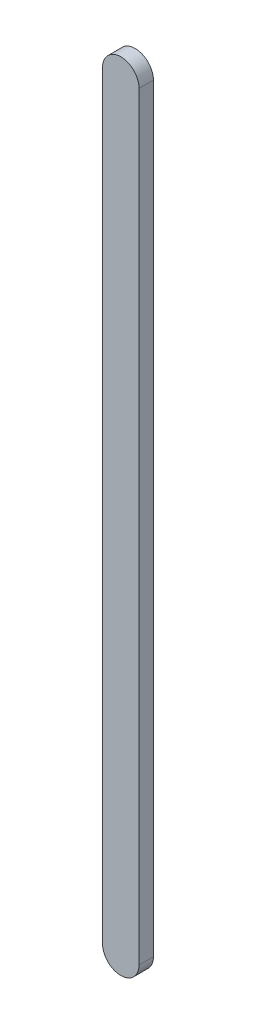
ISO-10303-21;
HEADER;
FILE_DESCRIPTION(('STEP AP214'),'2;1');
FILE_NAME('part.step','',(''),(''),'','','');
FILE_SCHEMA(('AUTOMOTIVE_DESIGN { 1 0 10303 214 1 1 1 1 }'));
ENDSEC;
DATA;
#1=APPLICATION_CONTEXT('core data for automotive mechanical design processes');
#2=APPLICATION_PROTOCOL_DEFINITION('international standard','automotive_design',2000,#1);
#3=PRODUCT_CONTEXT('',#1,'mechanical');
#4=PRODUCT('Part','Part','',(#3));
#5=PRODUCT_RELATED_PRODUCT_CATEGORY('part','',(#4));
#6=PRODUCT_DEFINITION_FORMATION('','',#4);
#7=PRODUCT_DEFINITION_CONTEXT('part definition',#1,'design');
#8=PRODUCT_DEFINITION('design','',#6,#7);
#9=PRODUCT_DEFINITION_SHAPE('','',#8);
#10=(LENGTH_UNIT() NAMED_UNIT(*) SI_UNIT(.MILLI.,.METRE.));
#11=(NAMED_UNIT(*) PLANE_ANGLE_UNIT() SI_UNIT($,.RADIAN.));
#12=(NAMED_UNIT(*) SI_UNIT($,.STERADIAN.) SOLID_ANGLE_UNIT());
#13=UNCERTAINTY_MEASURE_WITH_UNIT(LENGTH_MEASURE(1.E-05),#10,'distance_accuracy_value','');
#14=(GEOMETRIC_REPRESENTATION_CONTEXT(3) GLOBAL_UNCERTAINTY_ASSIGNED_CONTEXT((#13)) GLOBAL_UNIT_ASSIGNED_CONTEXT((#10,
#11,#12)) REPRESENTATION_CONTEXT('',''));
#15=CARTESIAN_POINT('',(0.,0.,0.));
#16=DIRECTION('',(0.,0.,1.));
#17=DIRECTION('',(1.,0.,0.));
#18=AXIS2_PLACEMENT_3D('',#15,#16,#17);
#19=CARTESIAN_POINT('',(142.24,85.8805496,0.));
#20=DIRECTION('',(-1.,0.,0.));
#21=DIRECTION('',(0.,1.,0.));
#22=AXIS2_PLACEMENT_3D('',#19,#20,#21);
#23=PLANE('',#22);
#24=DIRECTION('',(0.,1.,0.));
#25=VECTOR('',#24,1.);
#26=CARTESIAN_POINT('',(142.24,85.8805496,0.1999996));
#27=LINE('',#26,#25);
#28=CARTESIAN_POINT('',(142.24,85.8805496,0.1999996));
#29=VERTEX_POINT('',#28);
#30=CARTESIAN_POINT('',(142.24,96.4452732,0.1999996));
#31=VERTEX_POINT('',#30);
#32=EDGE_CURVE('E11',#29,#31,#27,.T.);
#33=ORIENTED_EDGE('',*,*,#32,.F.);
#34=DIRECTION('',(0.,0.,1.));
#35=VECTOR('',#34,1.);
#36=CARTESIAN_POINT('',(142.24,85.8805496,0.));
#37=LINE('',#36,#35);
#38=CARTESIAN_POINT('',(142.24,85.8805496,0.));
#39=VERTEX_POINT('',#38);
#40=EDGE_CURVE('E24',#39,#29,#37,.T.);
#41=ORIENTED_EDGE('',*,*,#40,.F.);
#42=DIRECTION('',(0.,1.,0.));
#43=VECTOR('',#42,1.);
#44=CARTESIAN_POINT('',(142.24,85.8805496,0.));
#45=LINE('',#44,#43);
#46=CARTESIAN_POINT('',(142.24,96.4452732,0.));
#47=VERTEX_POINT('',#46);
#48=EDGE_CURVE('E75',#39,#47,#45,.T.);
#49=ORIENTED_EDGE('',*,*,#48,.T.);
#50=DIRECTION('',(0.,0.,1.));
#51=VECTOR('',#50,1.);
#52=CARTESIAN_POINT('',(142.24,96.4452732,0.));
#53=LINE('',#52,#51);
#54=EDGE_CURVE('E37',#47,#31,#53,.T.);
#55=ORIENTED_EDGE('',*,*,#54,.T.);
#56=EDGE_LOOP('',(#33,#41,#49,#55));
#57=FACE_BOUND('',#56,.T.);
#58=ADVANCED_FACE('F17',(#57),#23,.F.);
#59=CARTESIAN_POINT('',(141.986,96.4452732,0.));
#60=DIRECTION('',(0.,0.,-1.));
#61=DIRECTION('',(1.,1.1189649382048E-13,0.));
#62=AXIS2_PLACEMENT_3D('',#59,#60,#61);
#63=CYLINDRICAL_SURFACE('',#62,0.25400000000001);
#64=CARTESIAN_POINT('',(141.986,96.4452732,0.1999996));
#65=DIRECTION('',(0.,0.,1.));
#66=DIRECTION('',(1.,1.1189649382048E-13,0.));
#67=AXIS2_PLACEMENT_3D('',#64,#65,#66);
#68=CIRCLE('',#67,0.25400000000001);
#69=CARTESIAN_POINT('',(141.732,96.4452732,0.1999996));
#70=VERTEX_POINT('',#69);
#71=EDGE_CURVE('E83',#31,#70,#68,.T.);
#72=ORIENTED_EDGE('',*,*,#71,.F.);
#73=ORIENTED_EDGE('',*,*,#54,.F.);
#74=CARTESIAN_POINT('',(141.986,96.4452732,0.));
#75=DIRECTION('',(0.,0.,1.));
#76=DIRECTION('',(1.,1.1189649382048E-13,0.));
#77=AXIS2_PLACEMENT_3D('',#74,#75,#76);
#78=CIRCLE('',#77,0.25400000000001);
#79=CARTESIAN_POINT('',(141.732,96.4452732,0.));
#80=VERTEX_POINT('',#79);
#81=EDGE_CURVE('E81',#47,#80,#78,.T.);
#82=ORIENTED_EDGE('',*,*,#81,.T.);
#83=DIRECTION('',(0.,0.,1.));
#84=VECTOR('',#83,1.);
#85=CARTESIAN_POINT('',(141.732,96.4452732,0.));
#86=LINE('',#85,#84);
#87=EDGE_CURVE('E67',#80,#70,#86,.T.);
#88=ORIENTED_EDGE('',*,*,#87,.T.);
#89=EDGE_LOOP('',(#72,#73,#82,#88));
#90=FACE_BOUND('',#89,.T.);
#91=ADVANCED_FACE('F89',(#90),#63,.T.);
#92=CARTESIAN_POINT('',(141.732,96.4452732,0.));
#93=DIRECTION('',(1.,0.,0.));
#94=DIRECTION('',(0.,-1.,0.));
#95=AXIS2_PLACEMENT_3D('',#92,#93,#94);
#96=PLANE('',#95);
#97=DIRECTION('',(0.,-1.,0.));
#98=VECTOR('',#97,1.);
#99=CARTESIAN_POINT('',(141.732,96.4452732,0.1999996));
#100=LINE('',#99,#98);
#101=CARTESIAN_POINT('',(141.732,85.8805496,0.1999996));
#102=VERTEX_POINT('',#101);
#103=EDGE_CURVE('E71',#70,#102,#100,.T.);
#104=ORIENTED_EDGE('',*,*,#103,.F.);
#105=ORIENTED_EDGE('',*,*,#87,.F.);
#106=DIRECTION('',(0.,-1.,0.));
#107=VECTOR('',#106,1.);
#108=CARTESIAN_POINT('',(141.732,96.4452732,0.));
#109=LINE('',#108,#107);
#110=CARTESIAN_POINT('',(141.732,85.8805496,0.));
#111=VERTEX_POINT('',#110);
#112=EDGE_CURVE('E63',#80,#111,#109,.T.);
#113=ORIENTED_EDGE('',*,*,#112,.T.);
#114=DIRECTION('',(0.,0.,1.));
#115=VECTOR('',#114,1.);
#116=CARTESIAN_POINT('',(141.732,85.8805496,0.));
#117=LINE('',#116,#115);
#118=EDGE_CURVE('E53',#111,#102,#117,.T.);
#119=ORIENTED_EDGE('',*,*,#118,.T.);
#120=EDGE_LOOP('',(#104,#105,#113,#119));
#121=FACE_BOUND('',#120,.T.);
#122=ADVANCED_FACE('F66',(#121),#96,.F.);
#123=CARTESIAN_POINT('',(141.986,85.8805496,0.));
#124=DIRECTION('',(0.,0.,-1.));
#125=DIRECTION('',(-1.,0.,0.));
#126=AXIS2_PLACEMENT_3D('',#123,#124,#125);
#127=CYLINDRICAL_SURFACE('',#126,0.254000000000005);
#128=CARTESIAN_POINT('',(141.986,85.8805496,0.1999996));
#129=DIRECTION('',(0.,0.,1.));
#130=DIRECTION('',(-1.,0.,0.));
#131=AXIS2_PLACEMENT_3D('',#128,#129,#130);
#132=CIRCLE('',#131,0.254000000000005);
#133=EDGE_CURVE('E59',#102,#29,#132,.T.);
#134=ORIENTED_EDGE('',*,*,#133,.F.);
#135=ORIENTED_EDGE('',*,*,#118,.F.);
#136=CARTESIAN_POINT('',(141.986,85.8805496,0.));
#137=DIRECTION('',(0.,0.,1.));
#138=DIRECTION('',(-1.,0.,0.));
#139=AXIS2_PLACEMENT_3D('',#136,#137,#138);
#140=CIRCLE('',#139,0.254000000000005);
#141=EDGE_CURVE('E57',#111,#39,#140,.T.);
#142=ORIENTED_EDGE('',*,*,#141,.T.);
#143=ORIENTED_EDGE('',*,*,#40,.T.);
#144=EDGE_LOOP('',(#134,#135,#142,#143));
#145=FACE_BOUND('',#144,.T.);
#146=ADVANCED_FACE('F55',(#145),#127,.T.);
#147=CARTESIAN_POINT('',(142.24,85.8805496,0.));
#148=DIRECTION('',(0.,0.,-1.));
#149=DIRECTION('',(-1.,0.,0.));
#150=AXIS2_PLACEMENT_3D('',#147,#148,#149);
#151=PLANE('',#150);
#152=ORIENTED_EDGE('',*,*,#141,.F.);
#153=ORIENTED_EDGE('',*,*,#112,.F.);
#154=ORIENTED_EDGE('',*,*,#81,.F.);
#155=ORIENTED_EDGE('',*,*,#48,.F.);
#156=EDGE_LOOP('',(#152,#153,#154,#155));
#157=FACE_BOUND('',#156,.T.);
#158=ADVANCED_FACE('F74',(#157),#151,.T.);
#159=CARTESIAN_POINT('',(142.24,85.8805496,0.1999996));
#160=DIRECTION('',(0.,0.,-1.));
#161=DIRECTION('',(-1.,0.,0.));
#162=AXIS2_PLACEMENT_3D('',#159,#160,#161);
#163=PLANE('',#162);
#164=ORIENTED_EDGE('',*,*,#32,.T.);
#165=ORIENTED_EDGE('',*,*,#71,.T.);
#166=ORIENTED_EDGE('',*,*,#103,.T.);
#167=ORIENTED_EDGE('',*,*,#133,.T.);
#168=EDGE_LOOP('',(#164,#165,#166,#167));
#169=FACE_BOUND('',#168,.T.);
#170=ADVANCED_FACE('F91',(#169),#163,.F.);
#171=CLOSED_SHELL('',(#58,#91,#122,#146,#158,#170));
#172=MANIFOLD_SOLID_BREP('B1',#171);
#173=ADVANCED_BREP_SHAPE_REPRESENTATION('',(#18,#172),#14);
#174=SHAPE_DEFINITION_REPRESENTATION(#9,#173);
ENDSEC;
END-ISO-10303-21;
